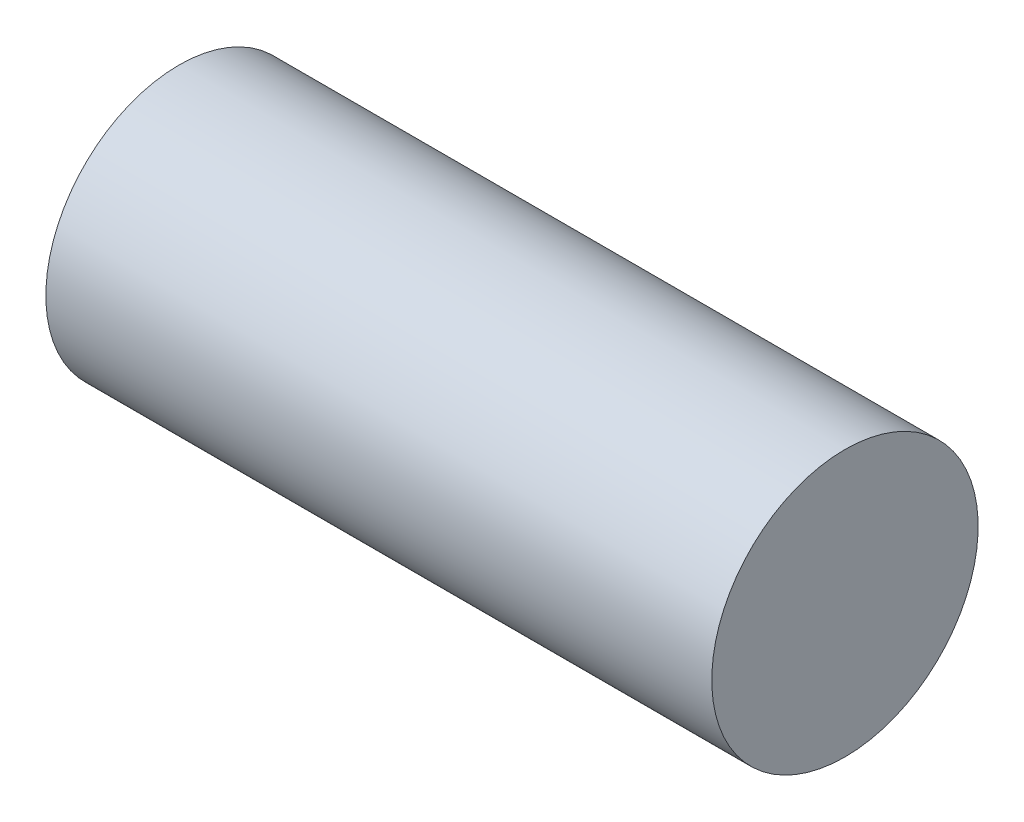
ISO-10303-21;
HEADER;
FILE_DESCRIPTION(('STEP AP214'),'2;1');
FILE_NAME('part.step','',(''),(''),'','','');
FILE_SCHEMA(('AUTOMOTIVE_DESIGN { 1 0 10303 214 1 1 1 1 }'));
ENDSEC;
DATA;
#1=APPLICATION_CONTEXT('core data for automotive mechanical design processes');
#2=APPLICATION_PROTOCOL_DEFINITION('international standard','automotive_design',2000,#1);
#3=PRODUCT_CONTEXT('',#1,'mechanical');
#4=PRODUCT('Part','Part','',(#3));
#5=PRODUCT_RELATED_PRODUCT_CATEGORY('part','',(#4));
#6=PRODUCT_DEFINITION_FORMATION('','',#4);
#7=PRODUCT_DEFINITION_CONTEXT('part definition',#1,'design');
#8=PRODUCT_DEFINITION('design','',#6,#7);
#9=PRODUCT_DEFINITION_SHAPE('','',#8);
#10=(LENGTH_UNIT() NAMED_UNIT(*) SI_UNIT(.MILLI.,.METRE.));
#11=(NAMED_UNIT(*) PLANE_ANGLE_UNIT() SI_UNIT($,.RADIAN.));
#12=(NAMED_UNIT(*) SI_UNIT($,.STERADIAN.) SOLID_ANGLE_UNIT());
#13=UNCERTAINTY_MEASURE_WITH_UNIT(LENGTH_MEASURE(1.E-05),#10,'distance_accuracy_value','');
#14=(GEOMETRIC_REPRESENTATION_CONTEXT(3) GLOBAL_UNCERTAINTY_ASSIGNED_CONTEXT((#13)) GLOBAL_UNIT_ASSIGNED_CONTEXT((#10,
#11,#12)) REPRESENTATION_CONTEXT('',''));
#15=CARTESIAN_POINT('',(0.,0.,0.));
#16=DIRECTION('',(0.,0.,1.));
#17=DIRECTION('',(1.,0.,0.));
#18=AXIS2_PLACEMENT_3D('',#15,#16,#17);
#19=CARTESIAN_POINT('',(33.,0.,0.));
#20=DIRECTION('',(1.,0.,0.));
#21=DIRECTION('',(0.,0.,-1.));
#22=AXIS2_PLACEMENT_3D('',#19,#20,#21);
#23=PLANE('',#22);
#24=CARTESIAN_POINT('',(33.,0.,0.));
#25=DIRECTION('',(1.,0.,0.));
#26=DIRECTION('',(0.,0.,-1.));
#27=AXIS2_PLACEMENT_3D('',#24,#25,#26);
#28=CIRCLE('',#27,13.);
#29=CARTESIAN_POINT('',(33.,13.,0.));
#30=VERTEX_POINT('',#29);
#31=EDGE_CURVE('E10',#30,#30,#28,.T.);
#32=ORIENTED_EDGE('',*,*,#31,.T.);
#33=EDGE_LOOP('',(#32));
#34=FACE_BOUND('',#33,.T.);
#35=ADVANCED_FACE('F15',(#34),#23,.T.);
#36=CARTESIAN_POINT('',(-33.,7.5,0.));
#37=DIRECTION('',(-1.,0.,0.));
#38=DIRECTION('',(0.,0.,1.));
#39=AXIS2_PLACEMENT_3D('',#36,#37,#38);
#40=PLANE('',#39);
#41=CARTESIAN_POINT('',(-33.,0.,0.));
#42=DIRECTION('',(1.,0.,0.));
#43=DIRECTION('',(0.,0.,-1.));
#44=AXIS2_PLACEMENT_3D('',#41,#42,#43);
#45=CIRCLE('',#44,7.5);
#46=CARTESIAN_POINT('',(-33.,7.5,0.));
#47=VERTEX_POINT('',#46);
#48=EDGE_CURVE('E26',#47,#47,#45,.T.);
#49=ORIENTED_EDGE('',*,*,#48,.F.);
#50=EDGE_LOOP('',(#49));
#51=FACE_BOUND('',#50,.T.);
#52=ADVANCED_FACE('F63',(#51),#40,.T.);
#53=CARTESIAN_POINT('',(-32.5,0.,0.));
#54=DIRECTION('',(-1.,0.,0.));
#55=DIRECTION('',(0.,1.,0.));
#56=AXIS2_PLACEMENT_3D('',#53,#54,#55);
#57=CYLINDRICAL_SURFACE('',#56,7.5);
#58=CARTESIAN_POINT('',(-32.,0.,0.));
#59=DIRECTION('',(1.,0.,0.));
#60=DIRECTION('',(0.,0.,-1.));
#61=AXIS2_PLACEMENT_3D('',#58,#59,#60);
#62=CIRCLE('',#61,7.5);
#63=CARTESIAN_POINT('',(-32.,7.5,0.));
#64=VERTEX_POINT('',#63);
#65=EDGE_CURVE('E41',#64,#64,#62,.T.);
#66=ORIENTED_EDGE('',*,*,#65,.F.);
#67=EDGE_LOOP('',(#66));
#68=FACE_BOUND('',#67,.T.);
#69=ORIENTED_EDGE('',*,*,#48,.T.);
#70=EDGE_LOOP('',(#69));
#71=FACE_BOUND('',#70,.T.);
#72=ADVANCED_FACE('F42',(#68,#71),#57,.T.);
#73=CARTESIAN_POINT('',(-32.,13.,0.));
#74=DIRECTION('',(-1.,0.,0.));
#75=DIRECTION('',(0.,0.,1.));
#76=AXIS2_PLACEMENT_3D('',#73,#74,#75);
#77=PLANE('',#76);
#78=CARTESIAN_POINT('',(-32.,0.,0.));
#79=DIRECTION('',(1.,0.,0.));
#80=DIRECTION('',(0.,0.,-1.));
#81=AXIS2_PLACEMENT_3D('',#78,#79,#80);
#82=CIRCLE('',#81,13.);
#83=CARTESIAN_POINT('',(-32.,13.,0.));
#84=VERTEX_POINT('',#83);
#85=EDGE_CURVE('E19',#84,#84,#82,.T.);
#86=ORIENTED_EDGE('',*,*,#85,.F.);
#87=EDGE_LOOP('',(#86));
#88=FACE_BOUND('',#87,.T.);
#89=ORIENTED_EDGE('',*,*,#65,.T.);
#90=EDGE_LOOP('',(#89));
#91=FACE_BOUND('',#90,.T.);
#92=ADVANCED_FACE('F56',(#88,#91),#77,.T.);
#93=CARTESIAN_POINT('',(0.5,0.,0.));
#94=DIRECTION('',(-1.,0.,0.));
#95=DIRECTION('',(0.,1.,0.));
#96=AXIS2_PLACEMENT_3D('',#93,#94,#95);
#97=CYLINDRICAL_SURFACE('',#96,13.);
#98=ORIENTED_EDGE('',*,*,#31,.F.);
#99=EDGE_LOOP('',(#98));
#100=FACE_BOUND('',#99,.T.);
#101=ORIENTED_EDGE('',*,*,#85,.T.);
#102=EDGE_LOOP('',(#101));
#103=FACE_BOUND('',#102,.T.);
#104=ADVANCED_FACE('F17',(#100,#103),#97,.T.);
#105=CLOSED_SHELL('',(#35,#52,#72,#92,#104));
#106=MANIFOLD_SOLID_BREP('B1',#105);
#107=ADVANCED_BREP_SHAPE_REPRESENTATION('',(#18,#106),#14);
#108=SHAPE_DEFINITION_REPRESENTATION(#9,#107);
ENDSEC;
END-ISO-10303-21;
